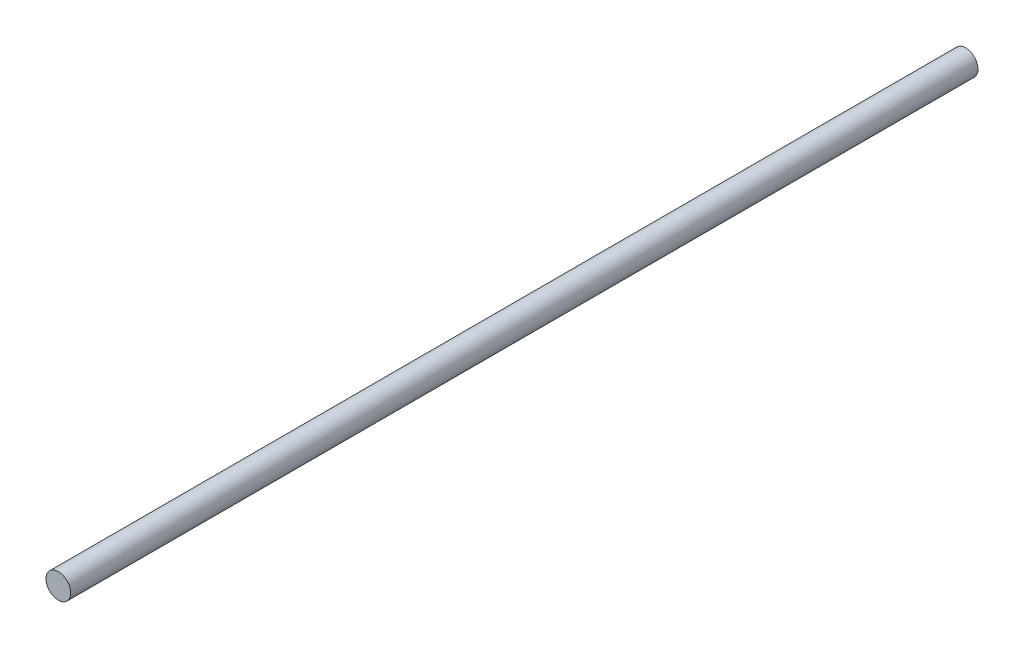
ISO-10303-21;
HEADER;
FILE_DESCRIPTION(('STEP AP214'),'2;1');
FILE_NAME('part.step','',(''),(''),'','','');
FILE_SCHEMA(('AUTOMOTIVE_DESIGN { 1 0 10303 214 1 1 1 1 }'));
ENDSEC;
DATA;
#1=APPLICATION_CONTEXT('core data for automotive mechanical design processes');
#2=APPLICATION_PROTOCOL_DEFINITION('international standard','automotive_design',2000,#1);
#3=PRODUCT_CONTEXT('',#1,'mechanical');
#4=PRODUCT('Part','Part','',(#3));
#5=PRODUCT_RELATED_PRODUCT_CATEGORY('part','',(#4));
#6=PRODUCT_DEFINITION_FORMATION('','',#4);
#7=PRODUCT_DEFINITION_CONTEXT('part definition',#1,'design');
#8=PRODUCT_DEFINITION('design','',#6,#7);
#9=PRODUCT_DEFINITION_SHAPE('','',#8);
#10=(LENGTH_UNIT() NAMED_UNIT(*) SI_UNIT(.MILLI.,.METRE.));
#11=(NAMED_UNIT(*) PLANE_ANGLE_UNIT() SI_UNIT($,.RADIAN.));
#12=(NAMED_UNIT(*) SI_UNIT($,.STERADIAN.) SOLID_ANGLE_UNIT());
#13=UNCERTAINTY_MEASURE_WITH_UNIT(LENGTH_MEASURE(1.E-05),#10,'distance_accuracy_value','');
#14=(GEOMETRIC_REPRESENTATION_CONTEXT(3) GLOBAL_UNCERTAINTY_ASSIGNED_CONTEXT((#13)) GLOBAL_UNIT_ASSIGNED_CONTEXT((#10,
#11,#12)) REPRESENTATION_CONTEXT('',''));
#15=CARTESIAN_POINT('',(0.,0.,0.));
#16=DIRECTION('',(0.,0.,1.));
#17=DIRECTION('',(1.,0.,0.));
#18=AXIS2_PLACEMENT_3D('',#15,#16,#17);
#19=CARTESIAN_POINT('',(0.,0.,-110.));
#20=DIRECTION('',(0.,0.,1.));
#21=DIRECTION('',(1.,0.,0.));
#22=AXIS2_PLACEMENT_3D('',#19,#20,#21);
#23=CYLINDRICAL_SURFACE('',#22,1.5);
#24=CARTESIAN_POINT('',(0.,0.,-110.));
#25=DIRECTION('',(0.,0.,1.));
#26=DIRECTION('',(1.,0.,0.));
#27=AXIS2_PLACEMENT_3D('',#24,#25,#26);
#28=CIRCLE('',#27,1.5);
#29=CARTESIAN_POINT('',(1.5,0.,-110.));
#30=VERTEX_POINT('',#29);
#31=EDGE_CURVE('E10',#30,#30,#28,.T.);
#32=ORIENTED_EDGE('',*,*,#31,.T.);
#33=EDGE_LOOP('',(#32));
#34=FACE_BOUND('',#33,.T.);
#35=CARTESIAN_POINT('',(0.,0.,0.));
#36=DIRECTION('',(0.,0.,1.));
#37=DIRECTION('',(1.,0.,0.));
#38=AXIS2_PLACEMENT_3D('',#35,#36,#37);
#39=CIRCLE('',#38,1.5);
#40=CARTESIAN_POINT('',(1.5,0.,0.));
#41=VERTEX_POINT('',#40);
#42=EDGE_CURVE('E40',#41,#41,#39,.T.);
#43=ORIENTED_EDGE('',*,*,#42,.F.);
#44=EDGE_LOOP('',(#43));
#45=FACE_BOUND('',#44,.T.);
#46=ADVANCED_FACE('F37',(#34,#45),#23,.T.);
#47=CARTESIAN_POINT('',(0.,0.,-110.));
#48=DIRECTION('',(0.,0.,1.));
#49=DIRECTION('',(1.,0.,0.));
#50=AXIS2_PLACEMENT_3D('',#47,#48,#49);
#51=PLANE('',#50);
#52=ORIENTED_EDGE('',*,*,#31,.F.);
#53=EDGE_LOOP('',(#52));
#54=FACE_BOUND('',#53,.T.);
#55=ADVANCED_FACE('F54',(#54),#51,.F.);
#56=CARTESIAN_POINT('',(0.,0.,0.));
#57=DIRECTION('',(0.,0.,1.));
#58=DIRECTION('',(1.,0.,0.));
#59=AXIS2_PLACEMENT_3D('',#56,#57,#58);
#60=PLANE('',#59);
#61=ORIENTED_EDGE('',*,*,#42,.T.);
#62=EDGE_LOOP('',(#61));
#63=FACE_BOUND('',#62,.T.);
#64=ADVANCED_FACE('F51',(#63),#60,.T.);
#65=CLOSED_SHELL('',(#46,#55,#64));
#66=MANIFOLD_SOLID_BREP('B2',#65);
#67=ADVANCED_BREP_SHAPE_REPRESENTATION('',(#18,#66),#14);
#68=SHAPE_DEFINITION_REPRESENTATION(#9,#67);
ENDSEC;
END-ISO-10303-21;
